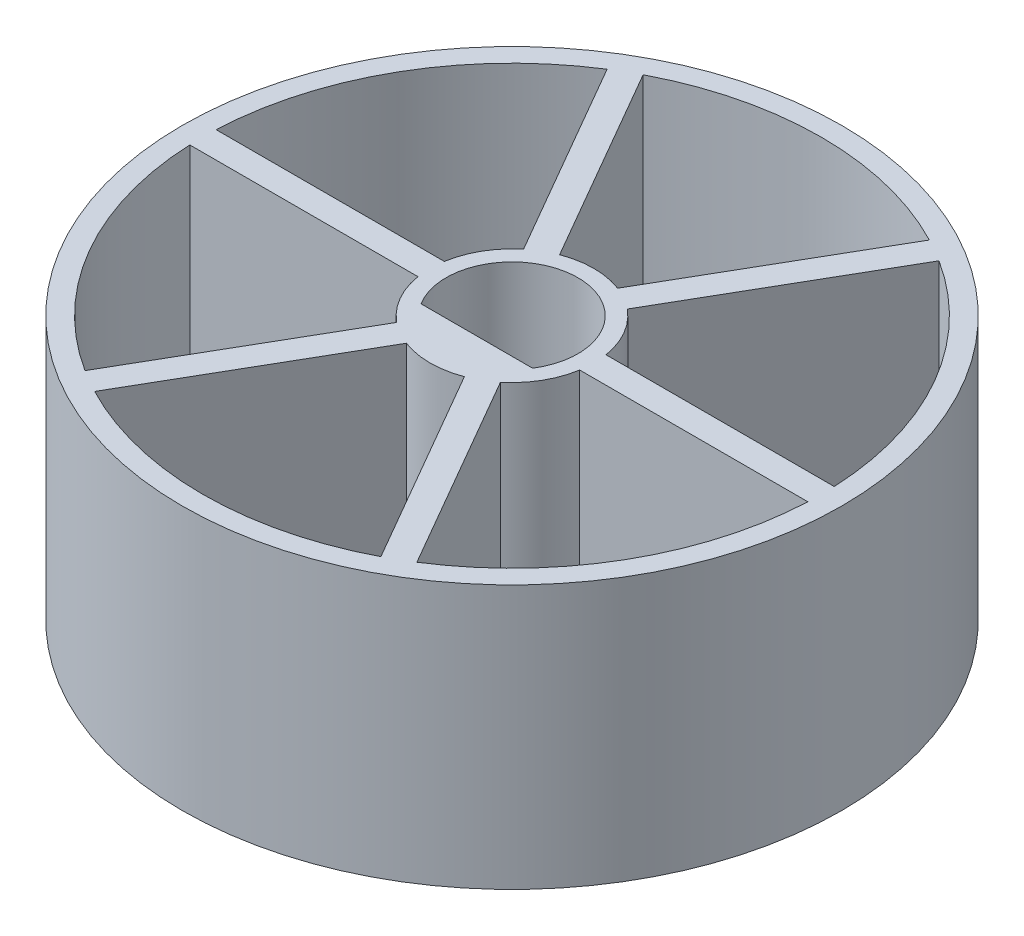
ISO-10303-21;
HEADER;
FILE_DESCRIPTION(('STEP AP214'),'2;1');
FILE_NAME('part.step','',(''),(''),'','','');
FILE_SCHEMA(('AUTOMOTIVE_DESIGN { 1 0 10303 214 1 1 1 1 }'));
ENDSEC;
DATA;
#1=APPLICATION_CONTEXT('core data for automotive mechanical design processes');
#2=APPLICATION_PROTOCOL_DEFINITION('international standard','automotive_design',2000,#1);
#3=PRODUCT_CONTEXT('',#1,'mechanical');
#4=PRODUCT('Part','Part','',(#3));
#5=PRODUCT_RELATED_PRODUCT_CATEGORY('part','',(#4));
#6=PRODUCT_DEFINITION_FORMATION('','',#4);
#7=PRODUCT_DEFINITION_CONTEXT('part definition',#1,'design');
#8=PRODUCT_DEFINITION('design','',#6,#7);
#9=PRODUCT_DEFINITION_SHAPE('','',#8);
#10=(LENGTH_UNIT() NAMED_UNIT(*) SI_UNIT(.MILLI.,.METRE.));
#11=(NAMED_UNIT(*) PLANE_ANGLE_UNIT() SI_UNIT($,.RADIAN.));
#12=(NAMED_UNIT(*) SI_UNIT($,.STERADIAN.) SOLID_ANGLE_UNIT());
#13=UNCERTAINTY_MEASURE_WITH_UNIT(LENGTH_MEASURE(1.E-05),#10,'distance_accuracy_value','');
#14=(GEOMETRIC_REPRESENTATION_CONTEXT(3) GLOBAL_UNCERTAINTY_ASSIGNED_CONTEXT((#13)) GLOBAL_UNIT_ASSIGNED_CONTEXT((#10,
#11,#12)) REPRESENTATION_CONTEXT('',''));
#15=CARTESIAN_POINT('',(0.,0.,0.));
#16=DIRECTION('',(0.,0.,1.));
#17=DIRECTION('',(1.,0.,0.));
#18=AXIS2_PLACEMENT_3D('',#15,#16,#17);
#19=CARTESIAN_POINT('',(1.29903810567634,30.,-0.749999999999863));
#20=DIRECTION('',(-0.866025403784424,0.,0.500000000000025));
#21=DIRECTION('',(0.500000000000025,0.,0.866025403784424));
#22=AXIS2_PLACEMENT_3D('',#19,#20,#21);
#23=PLANE('',#22);
#24=DIRECTION('',(-0.500000000000025,0.,-0.866025403784424));
#25=VECTOR('',#24,1.);
#26=CARTESIAN_POINT('',(1.29903810567634,0.,-0.749999999999863));
#27=LINE('',#26,#25);
#28=CARTESIAN_POINT('',(18.8740792651294,0.,29.6908642332852));
#29=VERTEX_POINT('',#28);
#30=CARTESIAN_POINT('',(5.89723766018952,0.,7.21431525175703));
#31=VERTEX_POINT('',#30);
#32=EDGE_CURVE('E305',#29,#31,#27,.T.);
#33=ORIENTED_EDGE('',*,*,#32,.T.);
#34=DIRECTION('',(0.,-1.,0.));
#35=VECTOR('',#34,1.);
#36=CARTESIAN_POINT('',(5.89723766018952,30.,7.21431525175703));
#37=LINE('',#36,#35);
#38=CARTESIAN_POINT('',(5.89723766018952,30.,7.21431525175703));
#39=VERTEX_POINT('',#38);
#40=EDGE_CURVE('E11',#39,#31,#37,.T.);
#41=ORIENTED_EDGE('',*,*,#40,.F.);
#42=DIRECTION('',(-0.500000000000025,0.,-0.866025403784424));
#43=VECTOR('',#42,1.);
#44=CARTESIAN_POINT('',(1.29903810567634,30.,-0.749999999999863));
#45=LINE('',#44,#43);
#46=CARTESIAN_POINT('',(18.8740792651294,30.,29.6908642332852));
#47=VERTEX_POINT('',#46);
#48=EDGE_CURVE('E220',#47,#39,#45,.T.);
#49=ORIENTED_EDGE('',*,*,#48,.F.);
#50=DIRECTION('',(0.,-1.,0.));
#51=VECTOR('',#50,1.);
#52=CARTESIAN_POINT('',(18.8740792651294,30.,29.6908642332852));
#53=LINE('',#52,#51);
#54=EDGE_CURVE('E52',#47,#29,#53,.T.);
#55=ORIENTED_EDGE('',*,*,#54,.T.);
#56=EDGE_LOOP('',(#33,#41,#49,#55));
#57=FACE_BOUND('',#56,.T.);
#58=ADVANCED_FACE('F33',(#57),#23,.F.);
#59=CARTESIAN_POINT('',(0.,30.,0.));
#60=DIRECTION('',(0.,-1.,0.));
#61=DIRECTION('',(0.,0.,-1.));
#62=AXIS2_PLACEMENT_3D('',#59,#60,#61);
#63=CYLINDRICAL_SURFACE('',#62,9.31792662412039);
#64=CARTESIAN_POINT('',(0.,0.,0.));
#65=DIRECTION('',(0.,1.,0.));
#66=DIRECTION('',(0.,0.,1.));
#67=AXIS2_PLACEMENT_3D('',#64,#65,#66);
#68=CIRCLE('',#67,9.31792662412039);
#69=CARTESIAN_POINT('',(9.19639910902585,0.,1.50000000000009));
#70=VERTEX_POINT('',#69);
#71=EDGE_CURVE('E226',#31,#70,#68,.T.);
#72=ORIENTED_EDGE('',*,*,#71,.T.);
#73=DIRECTION('',(0.,-1.,0.));
#74=VECTOR('',#73,1.);
#75=CARTESIAN_POINT('',(9.19639910902585,30.,1.50000000000009));
#76=LINE('',#75,#74);
#77=CARTESIAN_POINT('',(9.19639910902585,30.,1.50000000000009));
#78=VERTEX_POINT('',#77);
#79=EDGE_CURVE('E43',#78,#70,#76,.T.);
#80=ORIENTED_EDGE('',*,*,#79,.F.);
#81=CARTESIAN_POINT('',(0.,30.,0.));
#82=DIRECTION('',(0.,1.,0.));
#83=DIRECTION('',(0.,0.,1.));
#84=AXIS2_PLACEMENT_3D('',#81,#82,#83);
#85=CIRCLE('',#84,9.31792662412039);
#86=EDGE_CURVE('E214',#39,#78,#85,.T.);
#87=ORIENTED_EDGE('',*,*,#86,.F.);
#88=ORIENTED_EDGE('',*,*,#40,.T.);
#89=EDGE_LOOP('',(#72,#80,#87,#88));
#90=FACE_BOUND('',#89,.T.);
#91=ADVANCED_FACE('F225',(#90),#63,.T.);
#92=CARTESIAN_POINT('',(0.,30.,1.50000000000009));
#93=DIRECTION('',(0.,0.,1.));
#94=DIRECTION('',(1.,0.,0.));
#95=AXIS2_PLACEMENT_3D('',#92,#93,#94);
#96=PLANE('',#95);
#97=DIRECTION('',(-1.,0.,0.));
#98=VECTOR('',#97,1.);
#99=CARTESIAN_POINT('',(0.,0.,1.50000000000009));
#100=LINE('',#99,#98);
#101=CARTESIAN_POINT('',(35.1500823189047,0.,1.50000000000008));
#102=VERTEX_POINT('',#101);
#103=EDGE_CURVE('E308',#102,#70,#100,.T.);
#104=ORIENTED_EDGE('',*,*,#103,.F.);
#105=DIRECTION('',(0.,-1.,0.));
#106=VECTOR('',#105,1.);
#107=CARTESIAN_POINT('',(35.1500823189047,30.,1.50000000000008));
#108=LINE('',#107,#106);
#109=CARTESIAN_POINT('',(35.1500823189047,30.,1.50000000000008));
#110=VERTEX_POINT('',#109);
#111=EDGE_CURVE('E132',#110,#102,#108,.T.);
#112=ORIENTED_EDGE('',*,*,#111,.F.);
#113=DIRECTION('',(-1.,0.,0.));
#114=VECTOR('',#113,1.);
#115=CARTESIAN_POINT('',(0.,30.,1.50000000000009));
#116=LINE('',#115,#114);
#117=EDGE_CURVE('E219',#110,#78,#116,.T.);
#118=ORIENTED_EDGE('',*,*,#117,.T.);
#119=ORIENTED_EDGE('',*,*,#79,.T.);
#120=EDGE_LOOP('',(#104,#112,#118,#119));
#121=FACE_BOUND('',#120,.T.);
#122=ADVANCED_FACE('F230',(#121),#96,.T.);
#123=CARTESIAN_POINT('',(-1.29903810567666,30.,0.749999999999996));
#124=DIRECTION('',(0.86602540378444,0.,-0.499999999999998));
#125=DIRECTION('',(-0.499999999999998,0.,-0.86602540378444));
#126=AXIS2_PLACEMENT_3D('',#123,#124,#125);
#127=PLANE('',#126);
#128=DIRECTION('',(0.499999999999998,0.,0.86602540378444));
#129=VECTOR('',#128,1.);
#130=CARTESIAN_POINT('',(-1.29903810567666,0.,0.749999999999996));
#131=LINE('',#130,#129);
#132=CARTESIAN_POINT('',(-18.8740792651289,0.,-29.6908642332857));
#133=VERTEX_POINT('',#132);
#134=CARTESIAN_POINT('',(-5.89723766018957,0.,-7.21431525175699));
#135=VERTEX_POINT('',#134);
#136=EDGE_CURVE('E293',#133,#135,#131,.T.);
#137=ORIENTED_EDGE('',*,*,#136,.T.);
#138=DIRECTION('',(0.,-1.,0.));
#139=VECTOR('',#138,1.);
#140=CARTESIAN_POINT('',(-5.89723766018957,30.,-7.21431525175699));
#141=LINE('',#140,#139);
#142=CARTESIAN_POINT('',(-5.89723766018957,30.,-7.21431525175699));
#143=VERTEX_POINT('',#142);
#144=EDGE_CURVE('E315',#143,#135,#141,.T.);
#145=ORIENTED_EDGE('',*,*,#144,.F.);
#146=DIRECTION('',(0.499999999999998,0.,0.86602540378444));
#147=VECTOR('',#146,1.);
#148=CARTESIAN_POINT('',(-1.29903810567666,30.,0.749999999999996));
#149=LINE('',#148,#147);
#150=CARTESIAN_POINT('',(-18.8740792651289,30.,-29.6908642332857));
#151=VERTEX_POINT('',#150);
#152=EDGE_CURVE('E660',#151,#143,#149,.T.);
#153=ORIENTED_EDGE('',*,*,#152,.F.);
#154=DIRECTION('',(0.,-1.,0.));
#155=VECTOR('',#154,1.);
#156=CARTESIAN_POINT('',(-18.8740792651289,30.,-29.6908642332857));
#157=LINE('',#156,#155);
#158=EDGE_CURVE('E317',#151,#133,#157,.T.);
#159=ORIENTED_EDGE('',*,*,#158,.T.);
#160=EDGE_LOOP('',(#137,#145,#153,#159));
#161=FACE_BOUND('',#160,.T.);
#162=ADVANCED_FACE('F407',(#161),#127,.F.);
#163=CARTESIAN_POINT('',(0.,30.,0.));
#164=DIRECTION('',(0.,-1.,0.));
#165=DIRECTION('',(0.,0.,-1.));
#166=AXIS2_PLACEMENT_3D('',#163,#164,#165);
#167=CYLINDRICAL_SURFACE('',#166,9.31792662412039);
#168=CARTESIAN_POINT('',(0.,0.,0.));
#169=DIRECTION('',(0.,1.,0.));
#170=DIRECTION('',(0.,0.,1.));
#171=AXIS2_PLACEMENT_3D('',#168,#169,#170);
#172=CIRCLE('',#171,9.31792662412039);
#173=CARTESIAN_POINT('',(-9.19639910902586,0.,-1.5));
#174=VERTEX_POINT('',#173);
#175=EDGE_CURVE('E296',#135,#174,#172,.T.);
#176=ORIENTED_EDGE('',*,*,#175,.T.);
#177=DIRECTION('',(0.,-1.,0.));
#178=VECTOR('',#177,1.);
#179=CARTESIAN_POINT('',(-9.19639910902586,30.,-1.5));
#180=LINE('',#179,#178);
#181=CARTESIAN_POINT('',(-9.19639910902586,30.,-1.5));
#182=VERTEX_POINT('',#181);
#183=EDGE_CURVE('E322',#182,#174,#180,.T.);
#184=ORIENTED_EDGE('',*,*,#183,.F.);
#185=CARTESIAN_POINT('',(0.,30.,0.));
#186=DIRECTION('',(0.,1.,0.));
#187=DIRECTION('',(0.,0.,1.));
#188=AXIS2_PLACEMENT_3D('',#185,#186,#187);
#189=CIRCLE('',#188,9.31792662412039);
#190=EDGE_CURVE('E658',#143,#182,#189,.T.);
#191=ORIENTED_EDGE('',*,*,#190,.F.);
#192=ORIENTED_EDGE('',*,*,#144,.T.);
#193=EDGE_LOOP('',(#176,#184,#191,#192));
#194=FACE_BOUND('',#193,.T.);
#195=ADVANCED_FACE('F403',(#194),#167,.T.);
#196=CARTESIAN_POINT('',(0.,30.,-1.5));
#197=DIRECTION('',(0.,0.,-1.));
#198=DIRECTION('',(-1.,0.,0.));
#199=AXIS2_PLACEMENT_3D('',#196,#197,#198);
#200=PLANE('',#199);
#201=DIRECTION('',(1.,0.,0.));
#202=VECTOR('',#201,1.);
#203=CARTESIAN_POINT('',(0.,0.,-1.5));
#204=LINE('',#203,#202);
#205=CARTESIAN_POINT('',(-35.1500823189047,0.,-1.5));
#206=VERTEX_POINT('',#205);
#207=EDGE_CURVE('E299',#206,#174,#204,.T.);
#208=ORIENTED_EDGE('',*,*,#207,.F.);
#209=DIRECTION('',(0.,-1.,0.));
#210=VECTOR('',#209,1.);
#211=CARTESIAN_POINT('',(-35.1500823189047,30.,-1.5));
#212=LINE('',#211,#210);
#213=CARTESIAN_POINT('',(-35.1500823189047,30.,-1.5));
#214=VERTEX_POINT('',#213);
#215=EDGE_CURVE('E319',#214,#206,#212,.T.);
#216=ORIENTED_EDGE('',*,*,#215,.F.);
#217=DIRECTION('',(1.,0.,0.));
#218=VECTOR('',#217,1.);
#219=CARTESIAN_POINT('',(0.,30.,-1.5));
#220=LINE('',#219,#218);
#221=EDGE_CURVE('E653',#214,#182,#220,.T.);
#222=ORIENTED_EDGE('',*,*,#221,.T.);
#223=ORIENTED_EDGE('',*,*,#183,.T.);
#224=EDGE_LOOP('',(#208,#216,#222,#223));
#225=FACE_BOUND('',#224,.T.);
#226=ADVANCED_FACE('F399',(#225),#200,.T.);
#227=CARTESIAN_POINT('',(0.,30.,0.));
#228=DIRECTION('',(0.,-1.,0.));
#229=DIRECTION('',(0.,0.,-1.));
#230=AXIS2_PLACEMENT_3D('',#227,#228,#229);
#231=CYLINDRICAL_SURFACE('',#230,7.5);
#232=CARTESIAN_POINT('',(0.,0.,0.));
#233=DIRECTION('',(0.,1.,0.));
#234=DIRECTION('',(0.,0.,1.));
#235=AXIS2_PLACEMENT_3D('',#232,#233,#234);
#236=CIRCLE('',#235,7.5);
#237=CARTESIAN_POINT('',(6.34428877022476,0.,4.));
#238=VERTEX_POINT('',#237);
#239=CARTESIAN_POINT('',(-6.34428877022476,0.,4.));
#240=VERTEX_POINT('',#239);
#241=EDGE_CURVE('E284',#238,#240,#236,.T.);
#242=ORIENTED_EDGE('',*,*,#241,.F.);
#243=DIRECTION('',(0.,-1.,0.));
#244=VECTOR('',#243,1.);
#245=CARTESIAN_POINT('',(6.34428877022476,30.,4.));
#246=LINE('',#245,#244);
#247=CARTESIAN_POINT('',(6.34428877022476,30.,4.));
#248=VERTEX_POINT('',#247);
#249=EDGE_CURVE('E320',#248,#238,#246,.T.);
#250=ORIENTED_EDGE('',*,*,#249,.F.);
#251=CARTESIAN_POINT('',(0.,30.,0.));
#252=DIRECTION('',(0.,1.,0.));
#253=DIRECTION('',(0.,0.,1.));
#254=AXIS2_PLACEMENT_3D('',#251,#252,#253);
#255=CIRCLE('',#254,7.5);
#256=CARTESIAN_POINT('',(-6.34428877022476,30.,4.));
#257=VERTEX_POINT('',#256);
#258=EDGE_CURVE('E669',#248,#257,#255,.T.);
#259=ORIENTED_EDGE('',*,*,#258,.T.);
#260=DIRECTION('',(0.,-1.,0.));
#261=VECTOR('',#260,1.);
#262=CARTESIAN_POINT('',(-6.34428877022476,30.,4.));
#263=LINE('',#262,#261);
#264=EDGE_CURVE('E326',#257,#240,#263,.T.);
#265=ORIENTED_EDGE('',*,*,#264,.T.);
#266=EDGE_LOOP('',(#242,#250,#259,#265));
#267=FACE_BOUND('',#266,.T.);
#268=ADVANCED_FACE('F402',(#267),#231,.F.);
#269=CARTESIAN_POINT('',(0.,30.,0.));
#270=DIRECTION('',(0.,-1.,0.));
#271=DIRECTION('',(0.,0.,-1.));
#272=AXIS2_PLACEMENT_3D('',#269,#270,#271);
#273=CYLINDRICAL_SURFACE('',#272,35.1820733758796);
#274=CARTESIAN_POINT('',(0.,0.,0.));
#275=DIRECTION('',(0.,1.,0.));
#276=DIRECTION('',(0.,0.,1.));
#277=AXIS2_PLACEMENT_3D('',#274,#275,#276);
#278=CIRCLE('',#277,35.1820733758796);
#279=CARTESIAN_POINT('',(35.1500823189047,0.,-1.49999999999992));
#280=VERTEX_POINT('',#279);
#281=CARTESIAN_POINT('',(18.8740792651291,0.,-29.6908642332856));
#282=VERTEX_POINT('',#281);
#283=EDGE_CURVE('E272',#280,#282,#278,.T.);
#284=ORIENTED_EDGE('',*,*,#283,.F.);
#285=DIRECTION('',(0.,-1.,0.));
#286=VECTOR('',#285,1.);
#287=CARTESIAN_POINT('',(35.1500823189047,30.,-1.49999999999992));
#288=LINE('',#287,#286);
#289=CARTESIAN_POINT('',(35.1500823189047,30.,-1.49999999999992));
#290=VERTEX_POINT('',#289);
#291=EDGE_CURVE('E328',#290,#280,#288,.T.);
#292=ORIENTED_EDGE('',*,*,#291,.F.);
#293=CARTESIAN_POINT('',(0.,30.,0.));
#294=DIRECTION('',(0.,1.,0.));
#295=DIRECTION('',(0.,0.,1.));
#296=AXIS2_PLACEMENT_3D('',#293,#294,#295);
#297=CIRCLE('',#296,35.1820733758796);
#298=CARTESIAN_POINT('',(18.8740792651291,30.,-29.6908642332856));
#299=VERTEX_POINT('',#298);
#300=EDGE_CURVE('E680',#290,#299,#297,.T.);
#301=ORIENTED_EDGE('',*,*,#300,.T.);
#302=DIRECTION('',(0.,-1.,0.));
#303=VECTOR('',#302,1.);
#304=CARTESIAN_POINT('',(18.8740792651291,30.,-29.6908642332856));
#305=LINE('',#304,#303);
#306=EDGE_CURVE('E330',#299,#282,#305,.T.);
#307=ORIENTED_EDGE('',*,*,#306,.T.);
#308=EDGE_LOOP('',(#284,#292,#301,#307));
#309=FACE_BOUND('',#308,.T.);
#310=ADVANCED_FACE('F422',(#309),#273,.F.);
#311=CARTESIAN_POINT('',(0.,30.,-1.49999999999992));
#312=DIRECTION('',(0.,0.,1.));
#313=DIRECTION('',(1.,0.,0.));
#314=AXIS2_PLACEMENT_3D('',#311,#312,#313);
#315=PLANE('',#314);
#316=DIRECTION('',(-1.,0.,0.));
#317=VECTOR('',#316,1.);
#318=CARTESIAN_POINT('',(0.,0.,-1.49999999999992));
#319=LINE('',#318,#317);
#320=CARTESIAN_POINT('',(9.19639910902586,0.,-1.49999999999992));
#321=VERTEX_POINT('',#320);
#322=EDGE_CURVE('E275',#280,#321,#319,.T.);
#323=ORIENTED_EDGE('',*,*,#322,.T.);
#324=DIRECTION('',(0.,-1.,0.));
#325=VECTOR('',#324,1.);
#326=CARTESIAN_POINT('',(9.19639910902586,30.,-1.49999999999992));
#327=LINE('',#326,#325);
#328=CARTESIAN_POINT('',(9.19639910902586,30.,-1.49999999999992));
#329=VERTEX_POINT('',#328);
#330=EDGE_CURVE('E335',#329,#321,#327,.T.);
#331=ORIENTED_EDGE('',*,*,#330,.F.);
#332=DIRECTION('',(-1.,0.,0.));
#333=VECTOR('',#332,1.);
#334=CARTESIAN_POINT('',(0.,30.,-1.49999999999992));
#335=LINE('',#334,#333);
#336=EDGE_CURVE('E677',#290,#329,#335,.T.);
#337=ORIENTED_EDGE('',*,*,#336,.F.);
#338=ORIENTED_EDGE('',*,*,#291,.T.);
#339=EDGE_LOOP('',(#323,#331,#337,#338));
#340=FACE_BOUND('',#339,.T.);
#341=ADVANCED_FACE('F432',(#340),#315,.F.);
#342=CARTESIAN_POINT('',(0.,30.,0.));
#343=DIRECTION('',(0.,-1.,0.));
#344=DIRECTION('',(0.,0.,-1.));
#345=AXIS2_PLACEMENT_3D('',#342,#343,#344);
#346=CYLINDRICAL_SURFACE('',#345,9.31792662412039);
#347=CARTESIAN_POINT('',(0.,0.,0.));
#348=DIRECTION('',(0.,1.,0.));
#349=DIRECTION('',(0.,0.,1.));
#350=AXIS2_PLACEMENT_3D('',#347,#348,#349);
#351=CIRCLE('',#350,9.31792662412039);
#352=CARTESIAN_POINT('',(5.89723766018963,0.,-7.21431525175695));
#353=VERTEX_POINT('',#352);
#354=EDGE_CURVE('E278',#321,#353,#351,.T.);
#355=ORIENTED_EDGE('',*,*,#354,.T.);
#356=DIRECTION('',(0.,-1.,0.));
#357=VECTOR('',#356,1.);
#358=CARTESIAN_POINT('',(5.89723766018963,30.,-7.21431525175695));
#359=LINE('',#358,#357);
#360=CARTESIAN_POINT('',(5.89723766018963,30.,-7.21431525175695));
#361=VERTEX_POINT('',#360);
#362=EDGE_CURVE('E332',#361,#353,#359,.T.);
#363=ORIENTED_EDGE('',*,*,#362,.F.);
#364=CARTESIAN_POINT('',(0.,30.,0.));
#365=DIRECTION('',(0.,1.,0.));
#366=DIRECTION('',(0.,0.,1.));
#367=AXIS2_PLACEMENT_3D('',#364,#365,#366);
#368=CIRCLE('',#367,9.31792662412039);
#369=EDGE_CURVE('E675',#329,#361,#368,.T.);
#370=ORIENTED_EDGE('',*,*,#369,.F.);
#371=ORIENTED_EDGE('',*,*,#330,.T.);
#372=EDGE_LOOP('',(#355,#363,#370,#371));
#373=FACE_BOUND('',#372,.T.);
#374=ADVANCED_FACE('F428',(#373),#346,.T.);
#375=CARTESIAN_POINT('',(0.,30.,0.));
#376=DIRECTION('',(0.,-1.,0.));
#377=DIRECTION('',(0.,0.,-1.));
#378=AXIS2_PLACEMENT_3D('',#375,#376,#377);
#379=CYLINDRICAL_SURFACE('',#378,35.1820733758796);
#380=CARTESIAN_POINT('',(0.,0.,0.));
#381=DIRECTION('',(0.,1.,0.));
#382=DIRECTION('',(0.,0.,1.));
#383=AXIS2_PLACEMENT_3D('',#380,#381,#382);
#384=CIRCLE('',#383,35.1820733758796);
#385=CARTESIAN_POINT('',(16.2760030537758,0.,-31.1908642332856));
#386=VERTEX_POINT('',#385);
#387=CARTESIAN_POINT('',(-16.2760030537756,0.,-31.1908642332857));
#388=VERTEX_POINT('',#387);
#389=EDGE_CURVE('E260',#386,#388,#384,.T.);
#390=ORIENTED_EDGE('',*,*,#389,.F.);
#391=DIRECTION('',(0.,-1.,0.));
#392=VECTOR('',#391,1.);
#393=CARTESIAN_POINT('',(16.2760030537758,30.,-31.1908642332856));
#394=LINE('',#393,#392);
#395=CARTESIAN_POINT('',(16.2760030537758,30.,-31.1908642332856));
#396=VERTEX_POINT('',#395);
#397=EDGE_CURVE('E333',#396,#386,#394,.T.);
#398=ORIENTED_EDGE('',*,*,#397,.F.);
#399=CARTESIAN_POINT('',(0.,30.,0.));
#400=DIRECTION('',(0.,1.,0.));
#401=DIRECTION('',(0.,0.,1.));
#402=AXIS2_PLACEMENT_3D('',#399,#400,#401);
#403=CIRCLE('',#402,35.1820733758796);
#404=CARTESIAN_POINT('',(-16.2760030537756,30.,-31.1908642332857));
#405=VERTEX_POINT('',#404);
#406=EDGE_CURVE('E691',#396,#405,#403,.T.);
#407=ORIENTED_EDGE('',*,*,#406,.T.);
#408=DIRECTION('',(0.,-1.,0.));
#409=VECTOR('',#408,1.);
#410=CARTESIAN_POINT('',(-16.2760030537756,30.,-31.1908642332857));
#411=LINE('',#410,#409);
#412=EDGE_CURVE('E339',#405,#388,#411,.T.);
#413=ORIENTED_EDGE('',*,*,#412,.T.);
#414=EDGE_LOOP('',(#390,#398,#407,#413));
#415=FACE_BOUND('',#414,.T.);
#416=ADVANCED_FACE('F431',(#415),#379,.F.);
#417=CARTESIAN_POINT('',(-1.29903810567665,30.,-0.750000000000005));
#418=DIRECTION('',(0.866025403784436,0.,0.500000000000004));
#419=DIRECTION('',(0.500000000000004,0.,-0.866025403784436));
#420=AXIS2_PLACEMENT_3D('',#417,#418,#419);
#421=PLANE('',#420);
#422=DIRECTION('',(-0.500000000000004,0.,0.866025403784436));
#423=VECTOR('',#422,1.);
#424=CARTESIAN_POINT('',(-1.29903810567665,0.,-0.750000000000005));
#425=LINE('',#424,#423);
#426=CARTESIAN_POINT('',(3.29916144883632,0.,-8.71431525175696));
#427=VERTEX_POINT('',#426);
#428=EDGE_CURVE('E263',#386,#427,#425,.T.);
#429=ORIENTED_EDGE('',*,*,#428,.T.);
#430=DIRECTION('',(0.,-1.,0.));
#431=VECTOR('',#430,1.);
#432=CARTESIAN_POINT('',(3.29916144883632,30.,-8.71431525175696));
#433=LINE('',#432,#431);
#434=CARTESIAN_POINT('',(3.29916144883632,30.,-8.71431525175696));
#435=VERTEX_POINT('',#434);
#436=EDGE_CURVE('E344',#435,#427,#433,.T.);
#437=ORIENTED_EDGE('',*,*,#436,.F.);
#438=DIRECTION('',(-0.500000000000004,0.,0.866025403784436));
#439=VECTOR('',#438,1.);
#440=CARTESIAN_POINT('',(-1.29903810567665,30.,-0.750000000000005));
#441=LINE('',#440,#439);
#442=EDGE_CURVE('E688',#396,#435,#441,.T.);
#443=ORIENTED_EDGE('',*,*,#442,.F.);
#444=ORIENTED_EDGE('',*,*,#397,.T.);
#445=EDGE_LOOP('',(#429,#437,#443,#444));
#446=FACE_BOUND('',#445,.T.);
#447=ADVANCED_FACE('F448',(#446),#421,.F.);
#448=CARTESIAN_POINT('',(0.,30.,0.));
#449=DIRECTION('',(0.,-1.,0.));
#450=DIRECTION('',(0.,0.,-1.));
#451=AXIS2_PLACEMENT_3D('',#448,#449,#450);
#452=CYLINDRICAL_SURFACE('',#451,9.31792662412039);
#453=CARTESIAN_POINT('',(0.,0.,0.));
#454=DIRECTION('',(0.,1.,0.));
#455=DIRECTION('',(0.,0.,1.));
#456=AXIS2_PLACEMENT_3D('',#453,#454,#455);
#457=CIRCLE('',#456,9.31792662412039);
#458=CARTESIAN_POINT('',(-3.29916144883625,0.,-8.71431525175698));
#459=VERTEX_POINT('',#458);
#460=EDGE_CURVE('E266',#427,#459,#457,.T.);
#461=ORIENTED_EDGE('',*,*,#460,.T.);
#462=DIRECTION('',(0.,-1.,0.));
#463=VECTOR('',#462,1.);
#464=CARTESIAN_POINT('',(-3.29916144883625,30.,-8.71431525175698));
#465=LINE('',#464,#463);
#466=CARTESIAN_POINT('',(-3.29916144883625,30.,-8.71431525175698));
#467=VERTEX_POINT('',#466);
#468=EDGE_CURVE('E341',#467,#459,#465,.T.);
#469=ORIENTED_EDGE('',*,*,#468,.F.);
#470=CARTESIAN_POINT('',(0.,30.,0.));
#471=DIRECTION('',(0.,1.,0.));
#472=DIRECTION('',(0.,0.,1.));
#473=AXIS2_PLACEMENT_3D('',#470,#471,#472);
#474=CIRCLE('',#473,9.31792662412039);
#475=EDGE_CURVE('E686',#435,#467,#474,.T.);
#476=ORIENTED_EDGE('',*,*,#475,.F.);
#477=ORIENTED_EDGE('',*,*,#436,.T.);
#478=EDGE_LOOP('',(#461,#469,#476,#477));
#479=FACE_BOUND('',#478,.T.);
#480=ADVANCED_FACE('F444',(#479),#452,.T.);
#481=CARTESIAN_POINT('',(0.,30.,0.));
#482=DIRECTION('',(0.,-1.,0.));
#483=DIRECTION('',(0.,0.,-1.));
#484=AXIS2_PLACEMENT_3D('',#481,#482,#483);
#485=CYLINDRICAL_SURFACE('',#484,35.1820733758795);
#486=CARTESIAN_POINT('',(0.,0.,0.));
#487=DIRECTION('',(0.,1.,0.));
#488=DIRECTION('',(0.,0.,1.));
#489=AXIS2_PLACEMENT_3D('',#486,#487,#488);
#490=CIRCLE('',#489,35.1820733758795);
#491=CARTESIAN_POINT('',(-16.276003053776,0.,31.1908642332855));
#492=VERTEX_POINT('',#491);
#493=CARTESIAN_POINT('',(16.2760030537761,0.,31.1908642332852));
#494=VERTEX_POINT('',#493);
#495=EDGE_CURVE('E248',#492,#494,#490,.T.);
#496=ORIENTED_EDGE('',*,*,#495,.F.);
#497=DIRECTION('',(0.,-1.,0.));
#498=VECTOR('',#497,1.);
#499=CARTESIAN_POINT('',(-16.276003053776,30.,31.1908642332855));
#500=LINE('',#499,#498);
#501=CARTESIAN_POINT('',(-16.276003053776,30.,31.1908642332855));
#502=VERTEX_POINT('',#501);
#503=EDGE_CURVE('E342',#502,#492,#500,.T.);
#504=ORIENTED_EDGE('',*,*,#503,.F.);
#505=CARTESIAN_POINT('',(0.,30.,0.));
#506=DIRECTION('',(0.,1.,0.));
#507=DIRECTION('',(0.,0.,1.));
#508=AXIS2_PLACEMENT_3D('',#505,#506,#507);
#509=CIRCLE('',#508,35.1820733758795);
#510=CARTESIAN_POINT('',(16.2760030537761,30.,31.1908642332852));
#511=VERTEX_POINT('',#510);
#512=EDGE_CURVE('E702',#502,#511,#509,.T.);
#513=ORIENTED_EDGE('',*,*,#512,.T.);
#514=DIRECTION('',(0.,-1.,0.));
#515=VECTOR('',#514,1.);
#516=CARTESIAN_POINT('',(16.2760030537761,30.,31.1908642332852));
#517=LINE('',#516,#515);
#518=EDGE_CURVE('E348',#511,#494,#517,.T.);
#519=ORIENTED_EDGE('',*,*,#518,.T.);
#520=EDGE_LOOP('',(#496,#504,#513,#519));
#521=FACE_BOUND('',#520,.T.);
#522=ADVANCED_FACE('F447',(#521),#485,.F.);
#523=CARTESIAN_POINT('',(1.29903810567665,30.,0.750000000000016));
#524=DIRECTION('',(-0.866025403784433,0.,-0.50000000000001));
#525=DIRECTION('',(-0.50000000000001,0.,0.866025403784433));
#526=AXIS2_PLACEMENT_3D('',#523,#524,#525);
#527=PLANE('',#526);
#528=DIRECTION('',(0.50000000000001,0.,-0.866025403784433));
#529=VECTOR('',#528,1.);
#530=CARTESIAN_POINT('',(1.29903810567665,0.,0.750000000000016));
#531=LINE('',#530,#529);
#532=CARTESIAN_POINT('',(-3.29916144883637,0.,8.71431525175694));
#533=VERTEX_POINT('',#532);
#534=EDGE_CURVE('E251',#492,#533,#531,.T.);
#535=ORIENTED_EDGE('',*,*,#534,.T.);
#536=DIRECTION('',(0.,-1.,0.));
#537=VECTOR('',#536,1.);
#538=CARTESIAN_POINT('',(-3.29916144883637,30.,8.71431525175694));
#539=LINE('',#538,#537);
#540=CARTESIAN_POINT('',(-3.29916144883637,30.,8.71431525175694));
#541=VERTEX_POINT('',#540);
#542=EDGE_CURVE('E352',#541,#533,#539,.T.);
#543=ORIENTED_EDGE('',*,*,#542,.F.);
#544=DIRECTION('',(0.50000000000001,0.,-0.866025403784433));
#545=VECTOR('',#544,1.);
#546=CARTESIAN_POINT('',(1.29903810567665,30.,0.750000000000016));
#547=LINE('',#546,#545);
#548=EDGE_CURVE('E699',#502,#541,#547,.T.);
#549=ORIENTED_EDGE('',*,*,#548,.F.);
#550=ORIENTED_EDGE('',*,*,#503,.T.);
#551=EDGE_LOOP('',(#535,#543,#549,#550));
#552=FACE_BOUND('',#551,.T.);
#553=ADVANCED_FACE('F462',(#552),#527,.F.);
#554=CARTESIAN_POINT('',(0.,30.,0.));
#555=DIRECTION('',(0.,-1.,0.));
#556=DIRECTION('',(0.,0.,-1.));
#557=AXIS2_PLACEMENT_3D('',#554,#555,#556);
#558=CYLINDRICAL_SURFACE('',#557,9.31792662412039);
#559=CARTESIAN_POINT('',(0.,0.,0.));
#560=DIRECTION('',(0.,1.,0.));
#561=DIRECTION('',(0.,0.,1.));
#562=AXIS2_PLACEMENT_3D('',#559,#560,#561);
#563=CIRCLE('',#562,9.31792662412039);
#564=CARTESIAN_POINT('',(3.29916144883619,0.,8.71431525175701));
#565=VERTEX_POINT('',#564);
#566=EDGE_CURVE('E254',#533,#565,#563,.T.);
#567=ORIENTED_EDGE('',*,*,#566,.T.);
#568=DIRECTION('',(0.,-1.,0.));
#569=VECTOR('',#568,1.);
#570=CARTESIAN_POINT('',(3.29916144883619,30.,8.71431525175701));
#571=LINE('',#570,#569);
#572=CARTESIAN_POINT('',(3.29916144883619,30.,8.71431525175701));
#573=VERTEX_POINT('',#572);
#574=EDGE_CURVE('E350',#573,#565,#571,.T.);
#575=ORIENTED_EDGE('',*,*,#574,.F.);
#576=CARTESIAN_POINT('',(0.,30.,0.));
#577=DIRECTION('',(0.,1.,0.));
#578=DIRECTION('',(0.,0.,1.));
#579=AXIS2_PLACEMENT_3D('',#576,#577,#578);
#580=CIRCLE('',#579,9.31792662412039);
#581=EDGE_CURVE('E697',#541,#573,#580,.T.);
#582=ORIENTED_EDGE('',*,*,#581,.F.);
#583=ORIENTED_EDGE('',*,*,#542,.T.);
#584=EDGE_LOOP('',(#567,#575,#582,#583));
#585=FACE_BOUND('',#584,.T.);
#586=ADVANCED_FACE('F459',(#585),#558,.T.);
#587=CARTESIAN_POINT('',(0.,30.,0.));
#588=DIRECTION('',(0.,-1.,0.));
#589=DIRECTION('',(0.,0.,-1.));
#590=AXIS2_PLACEMENT_3D('',#587,#588,#589);
#591=CYLINDRICAL_SURFACE('',#590,35.1820733758796);
#592=CARTESIAN_POINT('',(0.,0.,0.));
#593=DIRECTION('',(0.,1.,0.));
#594=DIRECTION('',(0.,0.,1.));
#595=AXIS2_PLACEMENT_3D('',#592,#593,#594);
#596=CIRCLE('',#595,35.1820733758796);
#597=CARTESIAN_POINT('',(-35.1500823189047,0.,1.5));
#598=VERTEX_POINT('',#597);
#599=CARTESIAN_POINT('',(-18.8740792651293,0.,29.6908642332855));
#600=VERTEX_POINT('',#599);
#601=EDGE_CURVE('E237',#598,#600,#596,.T.);
#602=ORIENTED_EDGE('',*,*,#601,.F.);
#603=DIRECTION('',(0.,-1.,0.));
#604=VECTOR('',#603,1.);
#605=CARTESIAN_POINT('',(-35.1500823189047,30.,1.5));
#606=LINE('',#605,#604);
#607=CARTESIAN_POINT('',(-35.1500823189047,30.,1.5));
#608=VERTEX_POINT('',#607);
#609=EDGE_CURVE('E37',#608,#598,#606,.T.);
#610=ORIENTED_EDGE('',*,*,#609,.F.);
#611=CARTESIAN_POINT('',(0.,30.,0.));
#612=DIRECTION('',(0.,1.,0.));
#613=DIRECTION('',(0.,0.,1.));
#614=AXIS2_PLACEMENT_3D('',#611,#612,#613);
#615=CIRCLE('',#614,35.1820733758796);
#616=CARTESIAN_POINT('',(-18.8740792651293,30.,29.6908642332855));
#617=VERTEX_POINT('',#616);
#618=EDGE_CURVE('E313',#608,#617,#615,.T.);
#619=ORIENTED_EDGE('',*,*,#618,.T.);
#620=DIRECTION('',(0.,-1.,0.));
#621=VECTOR('',#620,1.);
#622=CARTESIAN_POINT('',(-18.8740792651293,30.,29.6908642332855));
#623=LINE('',#622,#621);
#624=EDGE_CURVE('E233',#617,#600,#623,.T.);
#625=ORIENTED_EDGE('',*,*,#624,.T.);
#626=EDGE_LOOP('',(#602,#610,#619,#625));
#627=FACE_BOUND('',#626,.T.);
#628=ADVANCED_FACE('F35',(#627),#591,.F.);
#629=CARTESIAN_POINT('',(0.,30.,1.5));
#630=DIRECTION('',(0.,0.,-1.));
#631=DIRECTION('',(-1.,0.,0.));
#632=AXIS2_PLACEMENT_3D('',#629,#630,#631);
#633=PLANE('',#632);
#634=DIRECTION('',(1.,0.,0.));
#635=VECTOR('',#634,1.);
#636=CARTESIAN_POINT('',(0.,0.,1.5));
#637=LINE('',#636,#635);
#638=CARTESIAN_POINT('',(-9.19639910902586,0.,1.5));
#639=VERTEX_POINT('',#638);
#640=EDGE_CURVE('E240',#598,#639,#637,.T.);
#641=ORIENTED_EDGE('',*,*,#640,.T.);
#642=DIRECTION('',(0.,-1.,0.));
#643=VECTOR('',#642,1.);
#644=CARTESIAN_POINT('',(-9.19639910902586,30.,1.5));
#645=LINE('',#644,#643);
#646=CARTESIAN_POINT('',(-9.19639910902586,30.,1.5));
#647=VERTEX_POINT('',#646);
#648=EDGE_CURVE('E358',#647,#639,#645,.T.);
#649=ORIENTED_EDGE('',*,*,#648,.F.);
#650=DIRECTION('',(1.,0.,0.));
#651=VECTOR('',#650,1.);
#652=CARTESIAN_POINT('',(0.,30.,1.5));
#653=LINE('',#652,#651);
#654=EDGE_CURVE('E367',#608,#647,#653,.T.);
#655=ORIENTED_EDGE('',*,*,#654,.F.);
#656=ORIENTED_EDGE('',*,*,#609,.T.);
#657=EDGE_LOOP('',(#641,#649,#655,#656));
#658=FACE_BOUND('',#657,.T.);
#659=ADVANCED_FACE('F366',(#658),#633,.F.);
#660=CARTESIAN_POINT('',(0.,30.,0.));
#661=DIRECTION('',(0.,-1.,0.));
#662=DIRECTION('',(0.,0.,-1.));
#663=AXIS2_PLACEMENT_3D('',#660,#661,#662);
#664=CYLINDRICAL_SURFACE('',#663,9.31792662412039);
#665=CARTESIAN_POINT('',(0.,0.,0.));
#666=DIRECTION('',(0.,1.,0.));
#667=DIRECTION('',(0.,0.,1.));
#668=AXIS2_PLACEMENT_3D('',#665,#666,#667);
#669=CIRCLE('',#668,9.31792662412039);
#670=CARTESIAN_POINT('',(-5.89723766018967,0.,7.21431525175691));
#671=VERTEX_POINT('',#670);
#672=EDGE_CURVE('E242',#639,#671,#669,.T.);
#673=ORIENTED_EDGE('',*,*,#672,.T.);
#674=DIRECTION('',(0.,-1.,0.));
#675=VECTOR('',#674,1.);
#676=CARTESIAN_POINT('',(-5.89723766018967,30.,7.21431525175691));
#677=LINE('',#676,#675);
#678=CARTESIAN_POINT('',(-5.89723766018967,30.,7.21431525175691));
#679=VERTEX_POINT('',#678);
#680=EDGE_CURVE('E357',#679,#671,#677,.T.);
#681=ORIENTED_EDGE('',*,*,#680,.F.);
#682=CARTESIAN_POINT('',(0.,30.,0.));
#683=DIRECTION('',(0.,1.,0.));
#684=DIRECTION('',(0.,0.,1.));
#685=AXIS2_PLACEMENT_3D('',#682,#683,#684);
#686=CIRCLE('',#685,9.31792662412039);
#687=EDGE_CURVE('E706',#647,#679,#686,.T.);
#688=ORIENTED_EDGE('',*,*,#687,.F.);
#689=ORIENTED_EDGE('',*,*,#648,.T.);
#690=EDGE_LOOP('',(#673,#681,#688,#689));
#691=FACE_BOUND('',#690,.T.);
#692=ADVANCED_FACE('F379',(#691),#664,.T.);
#693=CARTESIAN_POINT('',(0.,30.,0.));
#694=DIRECTION('',(0.,-1.,0.));
#695=DIRECTION('',(0.,0.,-1.));
#696=AXIS2_PLACEMENT_3D('',#693,#694,#695);
#697=CYLINDRICAL_SURFACE('',#696,35.1820733758796);
#698=CARTESIAN_POINT('',(0.,0.,0.));
#699=DIRECTION('',(0.,1.,0.));
#700=DIRECTION('',(0.,0.,1.));
#701=AXIS2_PLACEMENT_3D('',#698,#699,#700);
#702=CIRCLE('',#701,35.1820733758796);
#703=EDGE_CURVE('E302',#133,#206,#702,.T.);
#704=ORIENTED_EDGE('',*,*,#703,.F.);
#705=ORIENTED_EDGE('',*,*,#158,.F.);
#706=CARTESIAN_POINT('',(0.,30.,0.));
#707=DIRECTION('',(0.,1.,0.));
#708=DIRECTION('',(0.,0.,1.));
#709=AXIS2_PLACEMENT_3D('',#706,#707,#708);
#710=CIRCLE('',#709,35.1820733758796);
#711=EDGE_CURVE('E651',#151,#214,#710,.T.);
#712=ORIENTED_EDGE('',*,*,#711,.T.);
#713=ORIENTED_EDGE('',*,*,#215,.T.);
#714=EDGE_LOOP('',(#704,#705,#712,#713));
#715=FACE_BOUND('',#714,.T.);
#716=ADVANCED_FACE('F381',(#715),#697,.F.);
#717=CARTESIAN_POINT('',(0.,30.,0.));
#718=DIRECTION('',(0.,-1.,0.));
#719=DIRECTION('',(0.,0.,-1.));
#720=AXIS2_PLACEMENT_3D('',#717,#718,#719);
#721=CYLINDRICAL_SURFACE('',#720,37.5);
#722=CARTESIAN_POINT('',(0.,30.,0.));
#723=DIRECTION('',(0.,1.,0.));
#724=DIRECTION('',(0.,0.,1.));
#725=AXIS2_PLACEMENT_3D('',#722,#723,#724);
#726=CIRCLE('',#725,37.5);
#727=CARTESIAN_POINT('',(0.,30.,37.5));
#728=VERTEX_POINT('',#727);
#729=EDGE_CURVE('E663',#728,#728,#726,.T.);
#730=ORIENTED_EDGE('',*,*,#729,.F.);
#731=EDGE_LOOP('',(#730));
#732=FACE_BOUND('',#731,.T.);
#733=CARTESIAN_POINT('',(0.,0.,0.));
#734=DIRECTION('',(0.,1.,0.));
#735=DIRECTION('',(0.,0.,1.));
#736=AXIS2_PLACEMENT_3D('',#733,#734,#735);
#737=CIRCLE('',#736,37.5);
#738=CARTESIAN_POINT('',(0.,0.,37.5));
#739=VERTEX_POINT('',#738);
#740=EDGE_CURVE('E290',#739,#739,#737,.T.);
#741=ORIENTED_EDGE('',*,*,#740,.T.);
#742=EDGE_LOOP('',(#741));
#743=FACE_BOUND('',#742,.T.);
#744=ADVANCED_FACE('F387',(#732,#743),#721,.T.);
#745=CARTESIAN_POINT('',(0.,30.,4.));
#746=DIRECTION('',(0.,0.,-1.));
#747=DIRECTION('',(-1.,0.,0.));
#748=AXIS2_PLACEMENT_3D('',#745,#746,#747);
#749=PLANE('',#748);
#750=DIRECTION('',(1.,0.,0.));
#751=VECTOR('',#750,1.);
#752=CARTESIAN_POINT('',(0.,0.,4.));
#753=LINE('',#752,#751);
#754=EDGE_CURVE('E287',#240,#238,#753,.T.);
#755=ORIENTED_EDGE('',*,*,#754,.F.);
#756=ORIENTED_EDGE('',*,*,#264,.F.);
#757=DIRECTION('',(1.,0.,0.));
#758=VECTOR('',#757,1.);
#759=CARTESIAN_POINT('',(0.,30.,4.));
#760=LINE('',#759,#758);
#761=EDGE_CURVE('E666',#257,#248,#760,.T.);
#762=ORIENTED_EDGE('',*,*,#761,.T.);
#763=ORIENTED_EDGE('',*,*,#249,.T.);
#764=EDGE_LOOP('',(#755,#756,#762,#763));
#765=FACE_BOUND('',#764,.T.);
#766=ADVANCED_FACE('F414',(#765),#749,.T.);
#767=CARTESIAN_POINT('',(1.29903810567666,30.,0.750000000000008));
#768=DIRECTION('',(0.866025403784436,0.,0.500000000000004));
#769=DIRECTION('',(0.500000000000004,0.,-0.866025403784436));
#770=AXIS2_PLACEMENT_3D('',#767,#768,#769);
#771=PLANE('',#770);
#772=DIRECTION('',(-0.500000000000004,0.,0.866025403784436));
#773=VECTOR('',#772,1.);
#774=CARTESIAN_POINT('',(1.29903810567666,0.,0.750000000000008));
#775=LINE('',#774,#773);
#776=EDGE_CURVE('E281',#282,#353,#775,.T.);
#777=ORIENTED_EDGE('',*,*,#776,.F.);
#778=ORIENTED_EDGE('',*,*,#306,.F.);
#779=DIRECTION('',(-0.500000000000004,0.,0.866025403784436));
#780=VECTOR('',#779,1.);
#781=CARTESIAN_POINT('',(1.29903810567666,30.,0.750000000000008));
#782=LINE('',#781,#780);
#783=EDGE_CURVE('E672',#299,#361,#782,.T.);
#784=ORIENTED_EDGE('',*,*,#783,.T.);
#785=ORIENTED_EDGE('',*,*,#362,.T.);
#786=EDGE_LOOP('',(#777,#778,#784,#785));
#787=FACE_BOUND('',#786,.T.);
#788=ADVANCED_FACE('F418',(#787),#771,.T.);
#789=CARTESIAN_POINT('',(1.29903810567666,30.,-0.749999999999998));
#790=DIRECTION('',(0.86602540378444,0.,-0.499999999999998));
#791=DIRECTION('',(-0.499999999999998,0.,-0.86602540378444));
#792=AXIS2_PLACEMENT_3D('',#789,#790,#791);
#793=PLANE('',#792);
#794=DIRECTION('',(0.499999999999998,0.,0.86602540378444));
#795=VECTOR('',#794,1.);
#796=CARTESIAN_POINT('',(1.29903810567666,0.,-0.749999999999998));
#797=LINE('',#796,#795);
#798=EDGE_CURVE('E269',#388,#459,#797,.T.);
#799=ORIENTED_EDGE('',*,*,#798,.F.);
#800=ORIENTED_EDGE('',*,*,#412,.F.);
#801=DIRECTION('',(0.499999999999998,0.,0.86602540378444));
#802=VECTOR('',#801,1.);
#803=CARTESIAN_POINT('',(1.29903810567666,30.,-0.749999999999998));
#804=LINE('',#803,#802);
#805=EDGE_CURVE('E683',#405,#467,#804,.T.);
#806=ORIENTED_EDGE('',*,*,#805,.T.);
#807=ORIENTED_EDGE('',*,*,#468,.T.);
#808=EDGE_LOOP('',(#799,#800,#806,#807));
#809=FACE_BOUND('',#808,.T.);
#810=ADVANCED_FACE('F426',(#809),#793,.T.);
#811=CARTESIAN_POINT('',(-1.29903810567694,30.,0.750000000000213));
#812=DIRECTION('',(-0.866025403784424,0.,0.500000000000025));
#813=DIRECTION('',(0.500000000000025,0.,0.866025403784424));
#814=AXIS2_PLACEMENT_3D('',#811,#812,#813);
#815=PLANE('',#814);
#816=DIRECTION('',(-0.500000000000025,0.,-0.866025403784424));
#817=VECTOR('',#816,1.);
#818=CARTESIAN_POINT('',(-1.29903810567694,0.,0.750000000000213));
#819=LINE('',#818,#817);
#820=EDGE_CURVE('E257',#494,#565,#819,.T.);
#821=ORIENTED_EDGE('',*,*,#820,.F.);
#822=ORIENTED_EDGE('',*,*,#518,.F.);
#823=DIRECTION('',(-0.500000000000025,0.,-0.866025403784424));
#824=VECTOR('',#823,1.);
#825=CARTESIAN_POINT('',(-1.29903810567694,30.,0.750000000000213));
#826=LINE('',#825,#824);
#827=EDGE_CURVE('E694',#511,#573,#826,.T.);
#828=ORIENTED_EDGE('',*,*,#827,.T.);
#829=ORIENTED_EDGE('',*,*,#574,.T.);
#830=EDGE_LOOP('',(#821,#822,#828,#829));
#831=FACE_BOUND('',#830,.T.);
#832=ADVANCED_FACE('F442',(#831),#815,.T.);
#833=CARTESIAN_POINT('',(-1.29903810567665,30.,-0.750000000000014));
#834=DIRECTION('',(-0.866025403784433,0.,-0.50000000000001));
#835=DIRECTION('',(-0.50000000000001,0.,0.866025403784433));
#836=AXIS2_PLACEMENT_3D('',#833,#834,#835);
#837=PLANE('',#836);
#838=DIRECTION('',(0.50000000000001,0.,-0.866025403784433));
#839=VECTOR('',#838,1.);
#840=CARTESIAN_POINT('',(-1.29903810567665,0.,-0.750000000000014));
#841=LINE('',#840,#839);
#842=EDGE_CURVE('E245',#600,#671,#841,.T.);
#843=ORIENTED_EDGE('',*,*,#842,.F.);
#844=ORIENTED_EDGE('',*,*,#624,.F.);
#845=DIRECTION('',(0.50000000000001,0.,-0.866025403784433));
#846=VECTOR('',#845,1.);
#847=CARTESIAN_POINT('',(-1.29903810567665,30.,-0.750000000000014));
#848=LINE('',#847,#846);
#849=EDGE_CURVE('E377',#617,#679,#848,.T.);
#850=ORIENTED_EDGE('',*,*,#849,.T.);
#851=ORIENTED_EDGE('',*,*,#680,.T.);
#852=EDGE_LOOP('',(#843,#844,#850,#851));
#853=FACE_BOUND('',#852,.T.);
#854=ADVANCED_FACE('F376',(#853),#837,.T.);
#855=CARTESIAN_POINT('',(0.,30.,0.));
#856=DIRECTION('',(0.,-1.,0.));
#857=DIRECTION('',(0.,0.,-1.));
#858=AXIS2_PLACEMENT_3D('',#855,#856,#857);
#859=CYLINDRICAL_SURFACE('',#858,35.1820733758795);
#860=CARTESIAN_POINT('',(0.,0.,0.));
#861=DIRECTION('',(0.,1.,0.));
#862=DIRECTION('',(0.,0.,1.));
#863=AXIS2_PLACEMENT_3D('',#860,#861,#862);
#864=CIRCLE('',#863,35.1820733758795);
#865=EDGE_CURVE('E310',#29,#102,#864,.T.);
#866=ORIENTED_EDGE('',*,*,#865,.F.);
#867=ORIENTED_EDGE('',*,*,#54,.F.);
#868=CARTESIAN_POINT('',(0.,30.,0.));
#869=DIRECTION('',(0.,1.,0.));
#870=DIRECTION('',(0.,0.,1.));
#871=AXIS2_PLACEMENT_3D('',#868,#869,#870);
#872=CIRCLE('',#871,35.1820733758795);
#873=EDGE_CURVE('E231',#47,#110,#872,.T.);
#874=ORIENTED_EDGE('',*,*,#873,.T.);
#875=ORIENTED_EDGE('',*,*,#111,.T.);
#876=EDGE_LOOP('',(#866,#867,#874,#875));
#877=FACE_BOUND('',#876,.T.);
#878=ADVANCED_FACE('F470',(#877),#859,.F.);
#879=CARTESIAN_POINT('',(0.,30.,0.));
#880=DIRECTION('',(0.,1.,0.));
#881=DIRECTION('',(0.,0.,1.));
#882=AXIS2_PLACEMENT_3D('',#879,#880,#881);
#883=PLANE('',#882);
#884=ORIENTED_EDGE('',*,*,#618,.F.);
#885=ORIENTED_EDGE('',*,*,#654,.T.);
#886=ORIENTED_EDGE('',*,*,#687,.T.);
#887=ORIENTED_EDGE('',*,*,#849,.F.);
#888=EDGE_LOOP('',(#884,#885,#886,#887));
#889=FACE_BOUND('',#888,.T.);
#890=ORIENTED_EDGE('',*,*,#512,.F.);
#891=ORIENTED_EDGE('',*,*,#548,.T.);
#892=ORIENTED_EDGE('',*,*,#581,.T.);
#893=ORIENTED_EDGE('',*,*,#827,.F.);
#894=EDGE_LOOP('',(#890,#891,#892,#893));
#895=FACE_BOUND('',#894,.T.);
#896=ORIENTED_EDGE('',*,*,#406,.F.);
#897=ORIENTED_EDGE('',*,*,#442,.T.);
#898=ORIENTED_EDGE('',*,*,#475,.T.);
#899=ORIENTED_EDGE('',*,*,#805,.F.);
#900=EDGE_LOOP('',(#896,#897,#898,#899));
#901=FACE_BOUND('',#900,.T.);
#902=ORIENTED_EDGE('',*,*,#300,.F.);
#903=ORIENTED_EDGE('',*,*,#336,.T.);
#904=ORIENTED_EDGE('',*,*,#369,.T.);
#905=ORIENTED_EDGE('',*,*,#783,.F.);
#906=EDGE_LOOP('',(#902,#903,#904,#905));
#907=FACE_BOUND('',#906,.T.);
#908=ORIENTED_EDGE('',*,*,#258,.F.);
#909=ORIENTED_EDGE('',*,*,#761,.F.);
#910=EDGE_LOOP('',(#908,#909));
#911=FACE_BOUND('',#910,.T.);
#912=ORIENTED_EDGE('',*,*,#729,.T.);
#913=EDGE_LOOP('',(#912));
#914=FACE_BOUND('',#913,.T.);
#915=ORIENTED_EDGE('',*,*,#152,.T.);
#916=ORIENTED_EDGE('',*,*,#190,.T.);
#917=ORIENTED_EDGE('',*,*,#221,.F.);
#918=ORIENTED_EDGE('',*,*,#711,.F.);
#919=EDGE_LOOP('',(#915,#916,#917,#918));
#920=FACE_BOUND('',#919,.T.);
#921=ORIENTED_EDGE('',*,*,#48,.T.);
#922=ORIENTED_EDGE('',*,*,#86,.T.);
#923=ORIENTED_EDGE('',*,*,#117,.F.);
#924=ORIENTED_EDGE('',*,*,#873,.F.);
#925=EDGE_LOOP('',(#921,#922,#923,#924));
#926=FACE_BOUND('',#925,.T.);
#927=ADVANCED_FACE('F216',(#889,#895,#901,#907,#911,#914,#920,#926),#883,.T.);
#928=CARTESIAN_POINT('',(0.,0.,0.));
#929=DIRECTION('',(0.,1.,0.));
#930=DIRECTION('',(0.,0.,1.));
#931=AXIS2_PLACEMENT_3D('',#928,#929,#930);
#932=PLANE('',#931);
#933=ORIENTED_EDGE('',*,*,#601,.T.);
#934=ORIENTED_EDGE('',*,*,#842,.T.);
#935=ORIENTED_EDGE('',*,*,#672,.F.);
#936=ORIENTED_EDGE('',*,*,#640,.F.);
#937=EDGE_LOOP('',(#933,#934,#935,#936));
#938=FACE_BOUND('',#937,.T.);
#939=ORIENTED_EDGE('',*,*,#495,.T.);
#940=ORIENTED_EDGE('',*,*,#820,.T.);
#941=ORIENTED_EDGE('',*,*,#566,.F.);
#942=ORIENTED_EDGE('',*,*,#534,.F.);
#943=EDGE_LOOP('',(#939,#940,#941,#942));
#944=FACE_BOUND('',#943,.T.);
#945=ORIENTED_EDGE('',*,*,#389,.T.);
#946=ORIENTED_EDGE('',*,*,#798,.T.);
#947=ORIENTED_EDGE('',*,*,#460,.F.);
#948=ORIENTED_EDGE('',*,*,#428,.F.);
#949=EDGE_LOOP('',(#945,#946,#947,#948));
#950=FACE_BOUND('',#949,.T.);
#951=ORIENTED_EDGE('',*,*,#283,.T.);
#952=ORIENTED_EDGE('',*,*,#776,.T.);
#953=ORIENTED_EDGE('',*,*,#354,.F.);
#954=ORIENTED_EDGE('',*,*,#322,.F.);
#955=EDGE_LOOP('',(#951,#952,#953,#954));
#956=FACE_BOUND('',#955,.T.);
#957=ORIENTED_EDGE('',*,*,#241,.T.);
#958=ORIENTED_EDGE('',*,*,#754,.T.);
#959=EDGE_LOOP('',(#957,#958));
#960=FACE_BOUND('',#959,.T.);
#961=ORIENTED_EDGE('',*,*,#740,.F.);
#962=EDGE_LOOP('',(#961));
#963=FACE_BOUND('',#962,.T.);
#964=ORIENTED_EDGE('',*,*,#136,.F.);
#965=ORIENTED_EDGE('',*,*,#703,.T.);
#966=ORIENTED_EDGE('',*,*,#207,.T.);
#967=ORIENTED_EDGE('',*,*,#175,.F.);
#968=EDGE_LOOP('',(#964,#965,#966,#967));
#969=FACE_BOUND('',#968,.T.);
#970=ORIENTED_EDGE('',*,*,#32,.F.);
#971=ORIENTED_EDGE('',*,*,#865,.T.);
#972=ORIENTED_EDGE('',*,*,#103,.T.);
#973=ORIENTED_EDGE('',*,*,#71,.F.);
#974=EDGE_LOOP('',(#970,#971,#972,#973));
#975=FACE_BOUND('',#974,.T.);
#976=ADVANCED_FACE('F370',(#938,#944,#950,#956,#960,#963,#969,#975),#932,.F.);
#977=CLOSED_SHELL('',(#58,#91,#122,#162,#195,#226,#268,#310,#341,#374,#416,#447,#480,#522,#553,
#586,#628,#659,#692,#716,#744,#766,#788,#810,#832,#854,#878,#927,#976));
#978=MANIFOLD_SOLID_BREP('B2',#977);
#979=ADVANCED_BREP_SHAPE_REPRESENTATION('',(#18,#978),#14);
#980=SHAPE_DEFINITION_REPRESENTATION(#9,#979);
ENDSEC;
END-ISO-10303-21;
